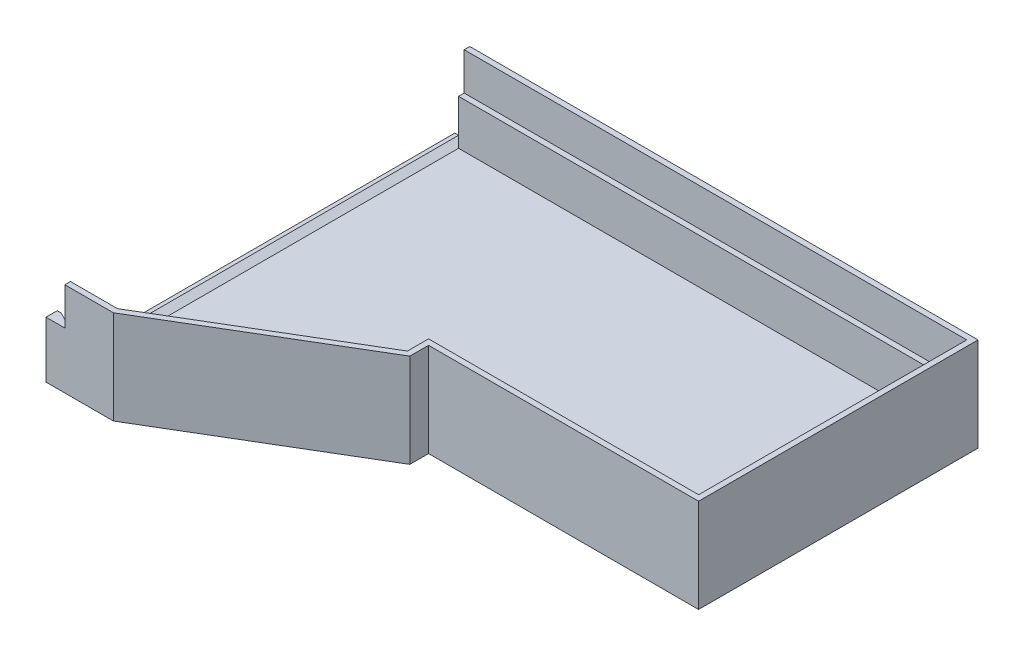
ISO-10303-21;
HEADER;
FILE_DESCRIPTION(('STEP AP214'),'2;1');
FILE_NAME('part.step','',(''),(''),'','','');
FILE_SCHEMA(('AUTOMOTIVE_DESIGN { 1 0 10303 214 1 1 1 1 }'));
ENDSEC;
DATA;
#1=APPLICATION_CONTEXT('core data for automotive mechanical design processes');
#2=APPLICATION_PROTOCOL_DEFINITION('international standard','automotive_design',2000,#1);
#3=PRODUCT_CONTEXT('',#1,'mechanical');
#4=PRODUCT('Part','Part','',(#3));
#5=PRODUCT_RELATED_PRODUCT_CATEGORY('part','',(#4));
#6=PRODUCT_DEFINITION_FORMATION('','',#4);
#7=PRODUCT_DEFINITION_CONTEXT('part definition',#1,'design');
#8=PRODUCT_DEFINITION('design','',#6,#7);
#9=PRODUCT_DEFINITION_SHAPE('','',#8);
#10=(LENGTH_UNIT() NAMED_UNIT(*) SI_UNIT(.MILLI.,.METRE.));
#11=(NAMED_UNIT(*) PLANE_ANGLE_UNIT() SI_UNIT($,.RADIAN.));
#12=(NAMED_UNIT(*) SI_UNIT($,.STERADIAN.) SOLID_ANGLE_UNIT());
#13=UNCERTAINTY_MEASURE_WITH_UNIT(LENGTH_MEASURE(1.E-05),#10,'distance_accuracy_value','');
#14=(GEOMETRIC_REPRESENTATION_CONTEXT(3) GLOBAL_UNCERTAINTY_ASSIGNED_CONTEXT((#13)) GLOBAL_UNIT_ASSIGNED_CONTEXT((#10,
#11,#12)) REPRESENTATION_CONTEXT('',''));
#15=CARTESIAN_POINT('',(0.,0.,0.));
#16=DIRECTION('',(0.,0.,1.));
#17=DIRECTION('',(1.,0.,0.));
#18=AXIS2_PLACEMENT_3D('',#15,#16,#17);
#19=CARTESIAN_POINT('',(-142.,25.,105.5));
#20=DIRECTION('',(0.,0.,-1.));
#21=DIRECTION('',(-1.,0.,0.));
#22=AXIS2_PLACEMENT_3D('',#19,#20,#21);
#23=PLANE('',#22);
#24=DIRECTION('',(0.,1.,0.));
#25=VECTOR('',#24,1.);
#26=CARTESIAN_POINT('',(-138.,15.,105.5));
#27=LINE('',#26,#25);
#28=CARTESIAN_POINT('',(-138.,15.,105.5));
#29=VERTEX_POINT('',#28);
#30=CARTESIAN_POINT('',(-138.,25.,105.5));
#31=VERTEX_POINT('',#30);
#32=EDGE_CURVE('E617',#29,#31,#27,.T.);
#33=ORIENTED_EDGE('',*,*,#32,.F.);
#34=DIRECTION('',(-1.,0.,0.));
#35=VECTOR('',#34,1.);
#36=CARTESIAN_POINT('',(-138.,15.,105.5));
#37=LINE('',#36,#35);
#38=CARTESIAN_POINT('',(-143.,15.,105.5));
#39=VERTEX_POINT('',#38);
#40=EDGE_CURVE('E197',#29,#39,#37,.T.);
#41=ORIENTED_EDGE('',*,*,#40,.T.);
#42=DIRECTION('',(0.,-1.,0.));
#43=VECTOR('',#42,1.);
#44=CARTESIAN_POINT('',(-143.,25.,105.5));
#45=LINE('',#44,#43);
#46=CARTESIAN_POINT('',(-143.,0.,105.5));
#47=VERTEX_POINT('',#46);
#48=EDGE_CURVE('E175',#39,#47,#45,.T.);
#49=ORIENTED_EDGE('',*,*,#48,.T.);
#50=DIRECTION('',(1.,0.,0.));
#51=VECTOR('',#50,1.);
#52=CARTESIAN_POINT('',(-142.,0.,105.5));
#53=LINE('',#52,#51);
#54=CARTESIAN_POINT('',(-125.036460316705,0.,105.5));
#55=VERTEX_POINT('',#54);
#56=EDGE_CURVE('E149',#47,#55,#53,.T.);
#57=ORIENTED_EDGE('',*,*,#56,.T.);
#58=DIRECTION('',(0.,-1.,0.));
#59=VECTOR('',#58,1.);
#60=CARTESIAN_POINT('',(-125.036460316705,25.,105.5));
#61=LINE('',#60,#59);
#62=CARTESIAN_POINT('',(-125.036460316705,25.,105.5));
#63=VERTEX_POINT('',#62);
#64=EDGE_CURVE('E172',#63,#55,#61,.T.);
#65=ORIENTED_EDGE('',*,*,#64,.F.);
#66=DIRECTION('',(-1.,0.,0.));
#67=VECTOR('',#66,1.);
#68=CARTESIAN_POINT('',(-142.,25.,105.5));
#69=LINE('',#68,#67);
#70=EDGE_CURVE('E103',#63,#31,#69,.T.);
#71=ORIENTED_EDGE('',*,*,#70,.T.);
#72=EDGE_LOOP('',(#33,#41,#49,#57,#65,#71));
#73=FACE_BOUND('',#72,.T.);
#74=ADVANCED_FACE('F45',(#73),#23,.F.);
#75=CARTESIAN_POINT('',(0.,25.,0.));
#76=DIRECTION('',(0.,1.,0.));
#77=DIRECTION('',(0.,0.,1.));
#78=AXIS2_PLACEMENT_3D('',#75,#76,#77);
#79=PLANE('',#78);
#80=DIRECTION('',(1.,0.,0.));
#81=VECTOR('',#80,1.);
#82=CARTESIAN_POINT('',(-138.,25.,104.));
#83=LINE('',#82,#81);
#84=CARTESIAN_POINT('',(-138.,25.,104.));
#85=VERTEX_POINT('',#84);
#86=CARTESIAN_POINT('',(-125.44940589526,25.,104.));
#87=VERTEX_POINT('',#86);
#88=EDGE_CURVE('E649',#85,#87,#83,.T.);
#89=ORIENTED_EDGE('',*,*,#88,.F.);
#90=DIRECTION('',(0.,0.,1.));
#91=VECTOR('',#90,1.);
#92=CARTESIAN_POINT('',(-138.,25.,104.));
#93=LINE('',#92,#91);
#94=EDGE_CURVE('E673',#85,#31,#93,.T.);
#95=ORIENTED_EDGE('',*,*,#94,.T.);
#96=ORIENTED_EDGE('',*,*,#70,.F.);
#97=DIRECTION('',(-0.859101543908756,0.,0.511805175094578));
#98=VECTOR('',#97,1.);
#99=CARTESIAN_POINT('',(-75.5,25.,75.9889172581332));
#100=LINE('',#99,#98);
#101=CARTESIAN_POINT('',(-75.5,25.,75.9889172581332));
#102=VERTEX_POINT('',#101);
#103=EDGE_CURVE('E131',#102,#63,#100,.T.);
#104=ORIENTED_EDGE('',*,*,#103,.F.);
#105=DIRECTION('',(0.,0.,1.));
#106=VECTOR('',#105,1.);
#107=CARTESIAN_POINT('',(-75.5,25.,71.));
#108=LINE('',#107,#106);
#109=CARTESIAN_POINT('',(-75.5,25.,71.));
#110=VERTEX_POINT('',#109);
#111=EDGE_CURVE('E116',#110,#102,#108,.T.);
#112=ORIENTED_EDGE('',*,*,#111,.F.);
#113=DIRECTION('',(-1.,0.,0.));
#114=VECTOR('',#113,1.);
#115=CARTESIAN_POINT('',(-3.5,25.,71.));
#116=LINE('',#115,#114);
#117=CARTESIAN_POINT('',(-3.5,25.,71.));
#118=VERTEX_POINT('',#117);
#119=EDGE_CURVE('E129',#118,#110,#116,.T.);
#120=ORIENTED_EDGE('',*,*,#119,.F.);
#121=DIRECTION('',(0.,0.,1.));
#122=VECTOR('',#121,1.);
#123=CARTESIAN_POINT('',(-3.5,25.,-3.5));
#124=LINE('',#123,#122);
#125=CARTESIAN_POINT('',(-3.5,25.,-3.5));
#126=VERTEX_POINT('',#125);
#127=EDGE_CURVE('E136',#126,#118,#124,.T.);
#128=ORIENTED_EDGE('',*,*,#127,.F.);
#129=DIRECTION('',(-1.,0.,0.));
#130=VECTOR('',#129,1.);
#131=CARTESIAN_POINT('',(-3.5,25.,-3.5));
#132=LINE('',#131,#130);
#133=CARTESIAN_POINT('',(-139.,25.,-3.5));
#134=VERTEX_POINT('',#133);
#135=EDGE_CURVE('E165',#126,#134,#132,.T.);
#136=ORIENTED_EDGE('',*,*,#135,.T.);
#137=DIRECTION('',(0.,0.,-1.));
#138=VECTOR('',#137,1.);
#139=CARTESIAN_POINT('',(-139.,25.,-3.5));
#140=LINE('',#139,#138);
#141=CARTESIAN_POINT('',(-139.,25.,-2.));
#142=VERTEX_POINT('',#141);
#143=EDGE_CURVE('E441',#142,#134,#140,.T.);
#144=ORIENTED_EDGE('',*,*,#143,.F.);
#145=DIRECTION('',(-1.,0.,0.));
#146=VECTOR('',#145,1.);
#147=CARTESIAN_POINT('',(-5.,25.,-2.));
#148=LINE('',#147,#146);
#149=CARTESIAN_POINT('',(-5.,25.,-2.));
#150=VERTEX_POINT('',#149);
#151=EDGE_CURVE('E670',#150,#142,#148,.T.);
#152=ORIENTED_EDGE('',*,*,#151,.F.);
#153=DIRECTION('',(0.,0.,-1.));
#154=VECTOR('',#153,1.);
#155=CARTESIAN_POINT('',(-5.,25.,69.5));
#156=LINE('',#155,#154);
#157=CARTESIAN_POINT('',(-5.,25.,69.5));
#158=VERTEX_POINT('',#157);
#159=EDGE_CURVE('E666',#158,#150,#156,.T.);
#160=ORIENTED_EDGE('',*,*,#159,.F.);
#161=DIRECTION('',(1.,0.,0.));
#162=VECTOR('',#161,1.);
#163=CARTESIAN_POINT('',(-77.,25.,69.5));
#164=LINE('',#163,#162);
#165=CARTESIAN_POINT('',(-77.,25.,69.5));
#166=VERTEX_POINT('',#165);
#167=EDGE_CURVE('E662',#166,#158,#164,.T.);
#168=ORIENTED_EDGE('',*,*,#167,.F.);
#169=DIRECTION('',(0.,0.,-1.));
#170=VECTOR('',#169,1.);
#171=CARTESIAN_POINT('',(-77.,25.,75.1365241475047));
#172=LINE('',#171,#170);
#173=CARTESIAN_POINT('',(-77.,25.,75.1365241475047));
#174=VERTEX_POINT('',#173);
#175=EDGE_CURVE('E658',#174,#166,#172,.T.);
#176=ORIENTED_EDGE('',*,*,#175,.F.);
#177=DIRECTION('',(0.859101543908756,0.,-0.511805175094578));
#178=VECTOR('',#177,1.);
#179=CARTESIAN_POINT('',(-125.44940589526,25.,104.));
#180=LINE('',#179,#178);
#181=EDGE_CURVE('E654',#87,#174,#180,.T.);
#182=ORIENTED_EDGE('',*,*,#181,.F.);
#183=EDGE_LOOP('',(#89,#95,#96,#104,#112,#120,#128,#136,#144,#152,#160,#168,#176,#182));
#184=FACE_BOUND('',#183,.T.);
#185=ADVANCED_FACE('F127',(#184),#79,.T.);
#186=CARTESIAN_POINT('',(-140.,3.,102.5));
#187=DIRECTION('',(0.,0.,1.));
#188=DIRECTION('',(1.,0.,0.));
#189=AXIS2_PLACEMENT_3D('',#186,#187,#188);
#190=PLANE('',#189);
#191=DIRECTION('',(0.,-1.,0.));
#192=VECTOR('',#191,1.);
#193=CARTESIAN_POINT('',(-139.,1.5,102.5));
#194=LINE('',#193,#192);
#195=CARTESIAN_POINT('',(-139.,15.,102.5));
#196=VERTEX_POINT('',#195);
#197=CARTESIAN_POINT('',(-139.,3.,102.5));
#198=VERTEX_POINT('',#197);
#199=EDGE_CURVE('E613',#196,#198,#194,.T.);
#200=ORIENTED_EDGE('',*,*,#199,.F.);
#201=DIRECTION('',(1.,0.,0.));
#202=VECTOR('',#201,1.);
#203=CARTESIAN_POINT('',(-139.,15.,102.5));
#204=LINE('',#203,#202);
#205=CARTESIAN_POINT('',(-125.862351473815,15.,102.5));
#206=VERTEX_POINT('',#205);
#207=EDGE_CURVE('E468',#196,#206,#204,.T.);
#208=ORIENTED_EDGE('',*,*,#207,.T.);
#209=DIRECTION('',(0.,1.,0.));
#210=VECTOR('',#209,1.);
#211=CARTESIAN_POINT('',(-125.862351473815,3.,102.5));
#212=LINE('',#211,#210);
#213=CARTESIAN_POINT('',(-125.862351473815,3.,102.5));
#214=VERTEX_POINT('',#213);
#215=EDGE_CURVE('E342',#214,#206,#212,.T.);
#216=ORIENTED_EDGE('',*,*,#215,.F.);
#217=DIRECTION('',(1.,0.,0.));
#218=VECTOR('',#217,1.);
#219=CARTESIAN_POINT('',(-140.,3.,102.5));
#220=LINE('',#219,#218);
#221=EDGE_CURVE('E452',#198,#214,#220,.T.);
#222=ORIENTED_EDGE('',*,*,#221,.F.);
#223=EDGE_LOOP('',(#200,#208,#216,#222));
#224=FACE_BOUND('',#223,.T.);
#225=ADVANCED_FACE('F381',(#224),#190,.F.);
#226=CARTESIAN_POINT('',(0.,3.,0.));
#227=DIRECTION('',(0.,1.,0.));
#228=DIRECTION('',(0.,0.,1.));
#229=AXIS2_PLACEMENT_3D('',#226,#227,#228);
#230=PLANE('',#229);
#231=DIRECTION('',(-1.,0.,0.));
#232=VECTOR('',#231,1.);
#233=CARTESIAN_POINT('',(-6.5,3.,-0.5));
#234=LINE('',#233,#232);
#235=CARTESIAN_POINT('',(-6.5,3.,-0.5));
#236=VERTEX_POINT('',#235);
#237=CARTESIAN_POINT('',(-139.,3.,-0.5));
#238=VERTEX_POINT('',#237);
#239=EDGE_CURVE('E332',#236,#238,#234,.T.);
#240=ORIENTED_EDGE('',*,*,#239,.T.);
#241=DIRECTION('',(0.,0.,1.));
#242=VECTOR('',#241,1.);
#243=CARTESIAN_POINT('',(-139.,3.,-3.5));
#244=LINE('',#243,#242);
#245=EDGE_CURVE('E427',#238,#198,#244,.T.);
#246=ORIENTED_EDGE('',*,*,#245,.T.);
#247=ORIENTED_EDGE('',*,*,#221,.T.);
#248=DIRECTION('',(0.859101543908756,0.,-0.511805175094578));
#249=VECTOR('',#248,1.);
#250=CARTESIAN_POINT('',(-125.862351473815,3.,102.5));
#251=LINE('',#250,#249);
#252=CARTESIAN_POINT('',(-78.5,3.,74.2841310368762));
#253=VERTEX_POINT('',#252);
#254=EDGE_CURVE('E455',#214,#253,#251,.T.);
#255=ORIENTED_EDGE('',*,*,#254,.T.);
#256=DIRECTION('',(0.,0.,-1.));
#257=VECTOR('',#256,1.);
#258=CARTESIAN_POINT('',(-78.5,3.,74.2841310368762));
#259=LINE('',#258,#257);
#260=CARTESIAN_POINT('',(-78.5,3.,68.));
#261=VERTEX_POINT('',#260);
#262=EDGE_CURVE('E459',#253,#261,#259,.T.);
#263=ORIENTED_EDGE('',*,*,#262,.T.);
#264=DIRECTION('',(1.,0.,0.));
#265=VECTOR('',#264,1.);
#266=CARTESIAN_POINT('',(-78.5,3.,68.));
#267=LINE('',#266,#265);
#268=CARTESIAN_POINT('',(-6.5,3.,68.));
#269=VERTEX_POINT('',#268);
#270=EDGE_CURVE('E334',#261,#269,#267,.T.);
#271=ORIENTED_EDGE('',*,*,#270,.T.);
#272=DIRECTION('',(0.,0.,-1.));
#273=VECTOR('',#272,1.);
#274=CARTESIAN_POINT('',(-6.5,3.,68.));
#275=LINE('',#274,#273);
#276=EDGE_CURVE('E320',#269,#236,#275,.T.);
#277=ORIENTED_EDGE('',*,*,#276,.T.);
#278=EDGE_LOOP('',(#240,#246,#247,#255,#263,#271,#277));
#279=FACE_BOUND('',#278,.T.);
#280=ADVANCED_FACE('F330',(#279),#230,.T.);
#281=CARTESIAN_POINT('',(-142.,25.,-3.5));
#282=DIRECTION('',(0.,0.,1.));
#283=DIRECTION('',(1.,0.,0.));
#284=AXIS2_PLACEMENT_3D('',#281,#282,#283);
#285=PLANE('',#284);
#286=DIRECTION('',(-1.,0.,0.));
#287=VECTOR('',#286,1.);
#288=CARTESIAN_POINT('',(-143.,3.,-3.5));
#289=LINE('',#288,#287);
#290=CARTESIAN_POINT('',(-142.,3.,-3.5));
#291=VERTEX_POINT('',#290);
#292=CARTESIAN_POINT('',(-143.,3.,-3.5));
#293=VERTEX_POINT('',#292);
#294=EDGE_CURVE('E419',#291,#293,#289,.T.);
#295=ORIENTED_EDGE('',*,*,#294,.F.);
#296=DIRECTION('',(0.894427190999916,-0.447213595499958,0.));
#297=VECTOR('',#296,1.);
#298=CARTESIAN_POINT('',(-139.,1.5,-3.5));
#299=LINE('',#298,#297);
#300=CARTESIAN_POINT('',(-139.,1.5,-3.5));
#301=VERTEX_POINT('',#300);
#302=EDGE_CURVE('E432',#291,#301,#299,.T.);
#303=ORIENTED_EDGE('',*,*,#302,.T.);
#304=DIRECTION('',(0.,1.,0.));
#305=VECTOR('',#304,1.);
#306=CARTESIAN_POINT('',(-139.,3.,-3.5));
#307=LINE('',#306,#305);
#308=EDGE_CURVE('E439',#301,#134,#307,.T.);
#309=ORIENTED_EDGE('',*,*,#308,.T.);
#310=ORIENTED_EDGE('',*,*,#135,.F.);
#311=DIRECTION('',(0.,-1.,0.));
#312=VECTOR('',#311,1.);
#313=CARTESIAN_POINT('',(-3.5,25.,-3.5));
#314=LINE('',#313,#312);
#315=CARTESIAN_POINT('',(-3.5,0.,-3.5));
#316=VERTEX_POINT('',#315);
#317=EDGE_CURVE('E63',#126,#316,#314,.T.);
#318=ORIENTED_EDGE('',*,*,#317,.T.);
#319=DIRECTION('',(-1.,0.,0.));
#320=VECTOR('',#319,1.);
#321=CARTESIAN_POINT('',(-142.,0.,-3.5));
#322=LINE('',#321,#320);
#323=CARTESIAN_POINT('',(-143.,0.,-3.5));
#324=VERTEX_POINT('',#323);
#325=EDGE_CURVE('E95',#316,#324,#322,.T.);
#326=ORIENTED_EDGE('',*,*,#325,.T.);
#327=DIRECTION('',(0.,-1.,0.));
#328=VECTOR('',#327,1.);
#329=CARTESIAN_POINT('',(-143.,25.,-3.5));
#330=LINE('',#329,#328);
#331=EDGE_CURVE('E55',#293,#324,#330,.T.);
#332=ORIENTED_EDGE('',*,*,#331,.F.);
#333=EDGE_LOOP('',(#295,#303,#309,#310,#318,#326,#332));
#334=FACE_BOUND('',#333,.T.);
#335=ADVANCED_FACE('F47',(#334),#285,.F.);
#336=CARTESIAN_POINT('',(-143.,25.,-3.5));
#337=DIRECTION('',(1.,0.,0.));
#338=DIRECTION('',(0.,0.,-1.));
#339=AXIS2_PLACEMENT_3D('',#336,#337,#338);
#340=PLANE('',#339);
#341=ORIENTED_EDGE('',*,*,#48,.F.);
#342=DIRECTION('',(0.,0.,-1.));
#343=VECTOR('',#342,1.);
#344=CARTESIAN_POINT('',(-143.,15.,105.5));
#345=LINE('',#344,#343);
#346=CARTESIAN_POINT('',(-143.,15.,102.5));
#347=VERTEX_POINT('',#346);
#348=EDGE_CURVE('E201',#39,#347,#345,.T.);
#349=ORIENTED_EDGE('',*,*,#348,.T.);
#350=DIRECTION('',(0.,1.,0.));
#351=VECTOR('',#350,1.);
#352=CARTESIAN_POINT('',(-143.,3.,102.5));
#353=LINE('',#352,#351);
#354=CARTESIAN_POINT('',(-143.,3.,102.5));
#355=VERTEX_POINT('',#354);
#356=EDGE_CURVE('E435',#355,#347,#353,.T.);
#357=ORIENTED_EDGE('',*,*,#356,.F.);
#358=DIRECTION('',(0.,0.,1.));
#359=VECTOR('',#358,1.);
#360=CARTESIAN_POINT('',(-143.,3.,-3.5));
#361=LINE('',#360,#359);
#362=EDGE_CURVE('E186',#293,#355,#361,.T.);
#363=ORIENTED_EDGE('',*,*,#362,.F.);
#364=ORIENTED_EDGE('',*,*,#331,.T.);
#365=DIRECTION('',(0.,0.,1.));
#366=VECTOR('',#365,1.);
#367=CARTESIAN_POINT('',(-143.,0.,-3.5));
#368=LINE('',#367,#366);
#369=EDGE_CURVE('E144',#324,#47,#368,.T.);
#370=ORIENTED_EDGE('',*,*,#369,.T.);
#371=EDGE_LOOP('',(#341,#349,#357,#363,#364,#370));
#372=FACE_BOUND('',#371,.T.);
#373=ADVANCED_FACE('F182',(#372),#340,.F.);
#374=CARTESIAN_POINT('',(-75.5,25.,75.9889172581332));
#375=DIRECTION('',(0.511805175094578,0.,0.859101543908756));
#376=DIRECTION('',(0.859101543908756,0.,-0.511805175094578));
#377=AXIS2_PLACEMENT_3D('',#374,#375,#376);
#378=PLANE('',#377);
#379=DIRECTION('',(-0.859101543908756,0.,0.511805175094578));
#380=VECTOR('',#379,1.);
#381=CARTESIAN_POINT('',(-75.5,0.,75.9889172581332));
#382=LINE('',#381,#380);
#383=CARTESIAN_POINT('',(-75.5,0.,75.9889172581332));
#384=VERTEX_POINT('',#383);
#385=EDGE_CURVE('E153',#384,#55,#382,.T.);
#386=ORIENTED_EDGE('',*,*,#385,.F.);
#387=DIRECTION('',(0.,-1.,0.));
#388=VECTOR('',#387,1.);
#389=CARTESIAN_POINT('',(-75.5,25.,75.9889172581332));
#390=LINE('',#389,#388);
#391=EDGE_CURVE('E123',#102,#384,#390,.T.);
#392=ORIENTED_EDGE('',*,*,#391,.F.);
#393=ORIENTED_EDGE('',*,*,#103,.T.);
#394=ORIENTED_EDGE('',*,*,#64,.T.);
#395=EDGE_LOOP('',(#386,#392,#393,#394));
#396=FACE_BOUND('',#395,.T.);
#397=ADVANCED_FACE('F365',(#396),#378,.T.);
#398=CARTESIAN_POINT('',(-75.5,25.,71.));
#399=DIRECTION('',(1.,0.,0.));
#400=DIRECTION('',(0.,0.,-1.));
#401=AXIS2_PLACEMENT_3D('',#398,#399,#400);
#402=PLANE('',#401);
#403=DIRECTION('',(0.,0.,1.));
#404=VECTOR('',#403,1.);
#405=CARTESIAN_POINT('',(-75.5,0.,71.));
#406=LINE('',#405,#404);
#407=CARTESIAN_POINT('',(-75.5,0.,71.));
#408=VERTEX_POINT('',#407);
#409=EDGE_CURVE('E118',#408,#384,#406,.T.);
#410=ORIENTED_EDGE('',*,*,#409,.F.);
#411=DIRECTION('',(0.,-1.,0.));
#412=VECTOR('',#411,1.);
#413=CARTESIAN_POINT('',(-75.5,25.,71.));
#414=LINE('',#413,#412);
#415=EDGE_CURVE('E113',#110,#408,#414,.T.);
#416=ORIENTED_EDGE('',*,*,#415,.F.);
#417=ORIENTED_EDGE('',*,*,#111,.T.);
#418=ORIENTED_EDGE('',*,*,#391,.T.);
#419=EDGE_LOOP('',(#410,#416,#417,#418));
#420=FACE_BOUND('',#419,.T.);
#421=ADVANCED_FACE('F115',(#420),#402,.T.);
#422=CARTESIAN_POINT('',(-3.5,25.,71.));
#423=DIRECTION('',(0.,0.,1.));
#424=DIRECTION('',(1.,0.,0.));
#425=AXIS2_PLACEMENT_3D('',#422,#423,#424);
#426=PLANE('',#425);
#427=DIRECTION('',(-1.,0.,0.));
#428=VECTOR('',#427,1.);
#429=CARTESIAN_POINT('',(-3.5,0.,71.));
#430=LINE('',#429,#428);
#431=CARTESIAN_POINT('',(-3.5,0.,71.));
#432=VERTEX_POINT('',#431);
#433=EDGE_CURVE('E159',#432,#408,#430,.T.);
#434=ORIENTED_EDGE('',*,*,#433,.F.);
#435=DIRECTION('',(0.,-1.,0.));
#436=VECTOR('',#435,1.);
#437=CARTESIAN_POINT('',(-3.5,25.,71.));
#438=LINE('',#437,#436);
#439=EDGE_CURVE('E87',#118,#432,#438,.T.);
#440=ORIENTED_EDGE('',*,*,#439,.F.);
#441=ORIENTED_EDGE('',*,*,#119,.T.);
#442=ORIENTED_EDGE('',*,*,#415,.T.);
#443=EDGE_LOOP('',(#434,#440,#441,#442));
#444=FACE_BOUND('',#443,.T.);
#445=ADVANCED_FACE('F134',(#444),#426,.T.);
#446=CARTESIAN_POINT('',(-3.5,25.,-3.5));
#447=DIRECTION('',(1.,0.,0.));
#448=DIRECTION('',(0.,0.,-1.));
#449=AXIS2_PLACEMENT_3D('',#446,#447,#448);
#450=PLANE('',#449);
#451=DIRECTION('',(0.,0.,1.));
#452=VECTOR('',#451,1.);
#453=CARTESIAN_POINT('',(-3.5,0.,-3.5));
#454=LINE('',#453,#452);
#455=EDGE_CURVE('E162',#316,#432,#454,.T.);
#456=ORIENTED_EDGE('',*,*,#455,.F.);
#457=ORIENTED_EDGE('',*,*,#317,.F.);
#458=ORIENTED_EDGE('',*,*,#127,.T.);
#459=ORIENTED_EDGE('',*,*,#439,.T.);
#460=EDGE_LOOP('',(#456,#457,#458,#459));
#461=FACE_BOUND('',#460,.T.);
#462=ADVANCED_FACE('F366',(#461),#450,.T.);
#463=CARTESIAN_POINT('',(0.,0.,0.));
#464=DIRECTION('',(0.,1.,0.));
#465=DIRECTION('',(0.,0.,1.));
#466=AXIS2_PLACEMENT_3D('',#463,#464,#465);
#467=PLANE('',#466);
#468=ORIENTED_EDGE('',*,*,#325,.F.);
#469=ORIENTED_EDGE('',*,*,#455,.T.);
#470=ORIENTED_EDGE('',*,*,#433,.T.);
#471=ORIENTED_EDGE('',*,*,#409,.T.);
#472=ORIENTED_EDGE('',*,*,#385,.T.);
#473=ORIENTED_EDGE('',*,*,#56,.F.);
#474=ORIENTED_EDGE('',*,*,#369,.F.);
#475=EDGE_LOOP('',(#468,#469,#470,#471,#472,#473,#474));
#476=FACE_BOUND('',#475,.T.);
#477=ADVANCED_FACE('F190',(#476),#467,.F.);
#478=CARTESIAN_POINT('',(-6.5,3.,-0.5));
#479=DIRECTION('',(0.,0.,-1.));
#480=DIRECTION('',(-1.,0.,0.));
#481=AXIS2_PLACEMENT_3D('',#478,#479,#480);
#482=PLANE('',#481);
#483=DIRECTION('',(0.,1.,0.));
#484=VECTOR('',#483,1.);
#485=CARTESIAN_POINT('',(-6.5,3.,-0.5));
#486=LINE('',#485,#484);
#487=CARTESIAN_POINT('',(-6.5,15.,-0.5));
#488=VERTEX_POINT('',#487);
#489=EDGE_CURVE('E145',#236,#488,#486,.T.);
#490=ORIENTED_EDGE('',*,*,#489,.T.);
#491=DIRECTION('',(-1.,0.,0.));
#492=VECTOR('',#491,1.);
#493=CARTESIAN_POINT('',(-6.5,15.,-0.5));
#494=LINE('',#493,#492);
#495=CARTESIAN_POINT('',(-139.,15.,-0.5));
#496=VERTEX_POINT('',#495);
#497=EDGE_CURVE('E702',#488,#496,#494,.T.);
#498=ORIENTED_EDGE('',*,*,#497,.T.);
#499=DIRECTION('',(0.,-1.,0.));
#500=VECTOR('',#499,1.);
#501=CARTESIAN_POINT('',(-139.,3.,-0.5));
#502=LINE('',#501,#500);
#503=EDGE_CURVE('E339',#496,#238,#502,.T.);
#504=ORIENTED_EDGE('',*,*,#503,.T.);
#505=ORIENTED_EDGE('',*,*,#239,.F.);
#506=EDGE_LOOP('',(#490,#498,#504,#505));
#507=FACE_BOUND('',#506,.T.);
#508=ADVANCED_FACE('F337',(#507),#482,.F.);
#509=CARTESIAN_POINT('',(-6.5,3.,68.));
#510=DIRECTION('',(1.,0.,0.));
#511=DIRECTION('',(0.,0.,-1.));
#512=AXIS2_PLACEMENT_3D('',#509,#510,#511);
#513=PLANE('',#512);
#514=DIRECTION('',(0.,1.,0.));
#515=VECTOR('',#514,1.);
#516=CARTESIAN_POINT('',(-6.5,3.,68.));
#517=LINE('',#516,#515);
#518=CARTESIAN_POINT('',(-6.50000000000001,15.,68.));
#519=VERTEX_POINT('',#518);
#520=EDGE_CURVE('E312',#269,#519,#517,.T.);
#521=ORIENTED_EDGE('',*,*,#520,.T.);
#522=DIRECTION('',(0.,0.,-1.));
#523=VECTOR('',#522,1.);
#524=CARTESIAN_POINT('',(-6.50000000000001,15.,68.));
#525=LINE('',#524,#523);
#526=EDGE_CURVE('E322',#519,#488,#525,.T.);
#527=ORIENTED_EDGE('',*,*,#526,.T.);
#528=ORIENTED_EDGE('',*,*,#489,.F.);
#529=ORIENTED_EDGE('',*,*,#276,.F.);
#530=EDGE_LOOP('',(#521,#527,#528,#529));
#531=FACE_BOUND('',#530,.T.);
#532=ADVANCED_FACE('F319',(#531),#513,.F.);
#533=CARTESIAN_POINT('',(-78.5,3.,68.));
#534=DIRECTION('',(0.,0.,1.));
#535=DIRECTION('',(1.,0.,0.));
#536=AXIS2_PLACEMENT_3D('',#533,#534,#535);
#537=PLANE('',#536);
#538=DIRECTION('',(0.,1.,0.));
#539=VECTOR('',#538,1.);
#540=CARTESIAN_POINT('',(-78.5,3.,68.));
#541=LINE('',#540,#539);
#542=CARTESIAN_POINT('',(-78.5,15.,68.));
#543=VERTEX_POINT('',#542);
#544=EDGE_CURVE('E352',#261,#543,#541,.T.);
#545=ORIENTED_EDGE('',*,*,#544,.T.);
#546=DIRECTION('',(1.,0.,0.));
#547=VECTOR('',#546,1.);
#548=CARTESIAN_POINT('',(-78.5,15.,68.));
#549=LINE('',#548,#547);
#550=EDGE_CURVE('E707',#543,#519,#549,.T.);
#551=ORIENTED_EDGE('',*,*,#550,.T.);
#552=ORIENTED_EDGE('',*,*,#520,.F.);
#553=ORIENTED_EDGE('',*,*,#270,.F.);
#554=EDGE_LOOP('',(#545,#551,#552,#553));
#555=FACE_BOUND('',#554,.T.);
#556=ADVANCED_FACE('F477',(#555),#537,.F.);
#557=CARTESIAN_POINT('',(-78.5,3.,74.2841310368762));
#558=DIRECTION('',(1.,0.,0.));
#559=DIRECTION('',(0.,0.,-1.));
#560=AXIS2_PLACEMENT_3D('',#557,#558,#559);
#561=PLANE('',#560);
#562=DIRECTION('',(0.,1.,0.));
#563=VECTOR('',#562,1.);
#564=CARTESIAN_POINT('',(-78.5,3.,74.2841310368762));
#565=LINE('',#564,#563);
#566=CARTESIAN_POINT('',(-78.5,15.,74.2841310368762));
#567=VERTEX_POINT('',#566);
#568=EDGE_CURVE('E346',#253,#567,#565,.T.);
#569=ORIENTED_EDGE('',*,*,#568,.T.);
#570=DIRECTION('',(0.,0.,-1.));
#571=VECTOR('',#570,1.);
#572=CARTESIAN_POINT('',(-78.5,15.,74.2841310368762));
#573=LINE('',#572,#571);
#574=EDGE_CURVE('E476',#567,#543,#573,.T.);
#575=ORIENTED_EDGE('',*,*,#574,.T.);
#576=ORIENTED_EDGE('',*,*,#544,.F.);
#577=ORIENTED_EDGE('',*,*,#262,.F.);
#578=EDGE_LOOP('',(#569,#575,#576,#577));
#579=FACE_BOUND('',#578,.T.);
#580=ADVANCED_FACE('F475',(#579),#561,.F.);
#581=CARTESIAN_POINT('',(-125.862351473815,3.,102.5));
#582=DIRECTION('',(0.511805175094578,0.,0.859101543908756));
#583=DIRECTION('',(0.859101543908756,0.,-0.511805175094578));
#584=AXIS2_PLACEMENT_3D('',#581,#582,#583);
#585=PLANE('',#584);
#586=ORIENTED_EDGE('',*,*,#215,.T.);
#587=DIRECTION('',(0.859101543908756,0.,-0.511805175094578));
#588=VECTOR('',#587,1.);
#589=CARTESIAN_POINT('',(-125.862351473815,15.,102.5));
#590=LINE('',#589,#588);
#591=EDGE_CURVE('E472',#206,#567,#590,.T.);
#592=ORIENTED_EDGE('',*,*,#591,.T.);
#593=ORIENTED_EDGE('',*,*,#568,.F.);
#594=ORIENTED_EDGE('',*,*,#254,.F.);
#595=EDGE_LOOP('',(#586,#592,#593,#594));
#596=FACE_BOUND('',#595,.T.);
#597=ADVANCED_FACE('F413',(#596),#585,.F.);
#598=ORIENTED_EDGE('',*,*,#356,.T.);
#599=DIRECTION('',(1.,0.,0.));
#600=VECTOR('',#599,1.);
#601=CARTESIAN_POINT('',(-143.,15.,102.5));
#602=LINE('',#601,#600);
#603=CARTESIAN_POINT('',(-142.,15.,102.5));
#604=VERTEX_POINT('',#603);
#605=EDGE_CURVE('E719',#347,#604,#602,.T.);
#606=ORIENTED_EDGE('',*,*,#605,.T.);
#607=DIRECTION('',(0.,1.,0.));
#608=VECTOR('',#607,1.);
#609=CARTESIAN_POINT('',(-142.,1.5,102.5));
#610=LINE('',#609,#608);
#611=CARTESIAN_POINT('',(-142.,3.,102.5));
#612=VERTEX_POINT('',#611);
#613=EDGE_CURVE('E610',#612,#604,#610,.T.);
#614=ORIENTED_EDGE('',*,*,#613,.F.);
#615=EDGE_CURVE('E420',#355,#612,#220,.T.);
#616=ORIENTED_EDGE('',*,*,#615,.F.);
#617=EDGE_LOOP('',(#598,#606,#614,#616));
#618=FACE_BOUND('',#617,.T.);
#619=ADVANCED_FACE('F402',(#618),#190,.F.);
#620=DIRECTION('',(0.,0.,1.));
#621=VECTOR('',#620,1.);
#622=CARTESIAN_POINT('',(-142.,3.,-3.5));
#623=LINE('',#622,#621);
#624=EDGE_CURVE('E418',#291,#612,#623,.T.);
#625=ORIENTED_EDGE('',*,*,#624,.F.);
#626=ORIENTED_EDGE('',*,*,#294,.T.);
#627=ORIENTED_EDGE('',*,*,#362,.T.);
#628=ORIENTED_EDGE('',*,*,#615,.T.);
#629=EDGE_LOOP('',(#625,#626,#627,#628));
#630=FACE_BOUND('',#629,.T.);
#631=ADVANCED_FACE('F397',(#630),#230,.T.);
#632=CARTESIAN_POINT('',(-139.,3.,-3.5));
#633=DIRECTION('',(1.,0.,0.));
#634=DIRECTION('',(0.,0.,-1.));
#635=AXIS2_PLACEMENT_3D('',#632,#633,#634);
#636=PLANE('',#635);
#637=DIRECTION('',(0.,-1.,0.));
#638=VECTOR('',#637,1.);
#639=CARTESIAN_POINT('',(-139.,1.5,104.));
#640=LINE('',#639,#638);
#641=CARTESIAN_POINT('',(-139.,15.,104.));
#642=VERTEX_POINT('',#641);
#643=CARTESIAN_POINT('',(-139.,1.5,104.));
#644=VERTEX_POINT('',#643);
#645=EDGE_CURVE('E428',#642,#644,#640,.T.);
#646=ORIENTED_EDGE('',*,*,#645,.F.);
#647=DIRECTION('',(0.,0.,1.));
#648=VECTOR('',#647,1.);
#649=CARTESIAN_POINT('',(-139.,15.,102.5));
#650=LINE('',#649,#648);
#651=EDGE_CURVE('E716',#196,#642,#650,.T.);
#652=ORIENTED_EDGE('',*,*,#651,.F.);
#653=ORIENTED_EDGE('',*,*,#199,.T.);
#654=ORIENTED_EDGE('',*,*,#245,.F.);
#655=ORIENTED_EDGE('',*,*,#503,.F.);
#656=DIRECTION('',(0.,0.,-1.));
#657=VECTOR('',#656,1.);
#658=CARTESIAN_POINT('',(-139.,15.,-0.5));
#659=LINE('',#658,#657);
#660=CARTESIAN_POINT('',(-139.,15.,-2.));
#661=VERTEX_POINT('',#660);
#662=EDGE_CURVE('E699',#496,#661,#659,.T.);
#663=ORIENTED_EDGE('',*,*,#662,.T.);
#664=DIRECTION('',(0.,1.,0.));
#665=VECTOR('',#664,1.);
#666=CARTESIAN_POINT('',(-139.,15.,-2.));
#667=LINE('',#666,#665);
#668=EDGE_CURVE('E622',#661,#142,#667,.T.);
#669=ORIENTED_EDGE('',*,*,#668,.T.);
#670=ORIENTED_EDGE('',*,*,#143,.T.);
#671=ORIENTED_EDGE('',*,*,#308,.F.);
#672=DIRECTION('',(0.,0.,1.));
#673=VECTOR('',#672,1.);
#674=CARTESIAN_POINT('',(-139.,1.5,-3.5));
#675=LINE('',#674,#673);
#676=EDGE_CURVE('E447',#301,#644,#675,.T.);
#677=ORIENTED_EDGE('',*,*,#676,.T.);
#678=EDGE_LOOP('',(#646,#652,#653,#654,#655,#663,#669,#670,#671,#677));
#679=FACE_BOUND('',#678,.T.);
#680=ADVANCED_FACE('F406',(#679),#636,.F.);
#681=CARTESIAN_POINT('',(-138.,15.,104.));
#682=DIRECTION('',(-1.,0.,0.));
#683=DIRECTION('',(0.,0.,1.));
#684=AXIS2_PLACEMENT_3D('',#681,#682,#683);
#685=PLANE('',#684);
#686=ORIENTED_EDGE('',*,*,#94,.F.);
#687=DIRECTION('',(0.,1.,0.));
#688=VECTOR('',#687,1.);
#689=CARTESIAN_POINT('',(-138.,15.,104.));
#690=LINE('',#689,#688);
#691=CARTESIAN_POINT('',(-138.,15.,104.));
#692=VERTEX_POINT('',#691);
#693=EDGE_CURVE('E645',#692,#85,#690,.T.);
#694=ORIENTED_EDGE('',*,*,#693,.F.);
#695=DIRECTION('',(0.,0.,1.));
#696=VECTOR('',#695,1.);
#697=CARTESIAN_POINT('',(-138.,15.,104.));
#698=LINE('',#697,#696);
#699=EDGE_CURVE('E653',#692,#29,#698,.T.);
#700=ORIENTED_EDGE('',*,*,#699,.T.);
#701=ORIENTED_EDGE('',*,*,#32,.T.);
#702=EDGE_LOOP('',(#686,#694,#700,#701));
#703=FACE_BOUND('',#702,.T.);
#704=ADVANCED_FACE('F411',(#703),#685,.T.);
#705=CARTESIAN_POINT('',(-5.,15.,-2.));
#706=DIRECTION('',(0.,0.,-1.));
#707=DIRECTION('',(-1.,0.,0.));
#708=AXIS2_PLACEMENT_3D('',#705,#706,#707);
#709=PLANE('',#708);
#710=ORIENTED_EDGE('',*,*,#151,.T.);
#711=ORIENTED_EDGE('',*,*,#668,.F.);
#712=DIRECTION('',(-1.,0.,0.));
#713=VECTOR('',#712,1.);
#714=CARTESIAN_POINT('',(-5.,15.,-2.));
#715=LINE('',#714,#713);
#716=CARTESIAN_POINT('',(-5.,15.,-2.));
#717=VERTEX_POINT('',#716);
#718=EDGE_CURVE('E695',#717,#661,#715,.T.);
#719=ORIENTED_EDGE('',*,*,#718,.F.);
#720=DIRECTION('',(0.,1.,0.));
#721=VECTOR('',#720,1.);
#722=CARTESIAN_POINT('',(-5.,15.,-2.));
#723=LINE('',#722,#721);
#724=EDGE_CURVE('E627',#717,#150,#723,.T.);
#725=ORIENTED_EDGE('',*,*,#724,.T.);
#726=EDGE_LOOP('',(#710,#711,#719,#725));
#727=FACE_BOUND('',#726,.T.);
#728=ADVANCED_FACE('F500',(#727),#709,.F.);
#729=CARTESIAN_POINT('',(-5.,15.,69.5));
#730=DIRECTION('',(1.,0.,0.));
#731=DIRECTION('',(0.,0.,-1.));
#732=AXIS2_PLACEMENT_3D('',#729,#730,#731);
#733=PLANE('',#732);
#734=ORIENTED_EDGE('',*,*,#159,.T.);
#735=ORIENTED_EDGE('',*,*,#724,.F.);
#736=DIRECTION('',(0.,0.,-1.));
#737=VECTOR('',#736,1.);
#738=CARTESIAN_POINT('',(-5.,15.,69.5));
#739=LINE('',#738,#737);
#740=CARTESIAN_POINT('',(-5.,15.,69.5));
#741=VERTEX_POINT('',#740);
#742=EDGE_CURVE('E691',#741,#717,#739,.T.);
#743=ORIENTED_EDGE('',*,*,#742,.F.);
#744=DIRECTION('',(0.,1.,0.));
#745=VECTOR('',#744,1.);
#746=CARTESIAN_POINT('',(-5.,15.,69.5));
#747=LINE('',#746,#745);
#748=EDGE_CURVE('E631',#741,#158,#747,.T.);
#749=ORIENTED_EDGE('',*,*,#748,.T.);
#750=EDGE_LOOP('',(#734,#735,#743,#749));
#751=FACE_BOUND('',#750,.T.);
#752=ADVANCED_FACE('F510',(#751),#733,.F.);
#753=CARTESIAN_POINT('',(-77.,15.,69.5));
#754=DIRECTION('',(0.,0.,1.));
#755=DIRECTION('',(1.,0.,0.));
#756=AXIS2_PLACEMENT_3D('',#753,#754,#755);
#757=PLANE('',#756);
#758=ORIENTED_EDGE('',*,*,#167,.T.);
#759=ORIENTED_EDGE('',*,*,#748,.F.);
#760=DIRECTION('',(1.,0.,0.));
#761=VECTOR('',#760,1.);
#762=CARTESIAN_POINT('',(-77.,15.,69.5));
#763=LINE('',#762,#761);
#764=CARTESIAN_POINT('',(-77.,15.,69.5));
#765=VERTEX_POINT('',#764);
#766=EDGE_CURVE('E687',#765,#741,#763,.T.);
#767=ORIENTED_EDGE('',*,*,#766,.F.);
#768=DIRECTION('',(0.,1.,0.));
#769=VECTOR('',#768,1.);
#770=CARTESIAN_POINT('',(-77.,15.,69.5));
#771=LINE('',#770,#769);
#772=EDGE_CURVE('E636',#765,#166,#771,.T.);
#773=ORIENTED_EDGE('',*,*,#772,.T.);
#774=EDGE_LOOP('',(#758,#759,#767,#773));
#775=FACE_BOUND('',#774,.T.);
#776=ADVANCED_FACE('F519',(#775),#757,.F.);
#777=CARTESIAN_POINT('',(-77.,15.,75.1365241475047));
#778=DIRECTION('',(1.,0.,0.));
#779=DIRECTION('',(0.,0.,-1.));
#780=AXIS2_PLACEMENT_3D('',#777,#778,#779);
#781=PLANE('',#780);
#782=ORIENTED_EDGE('',*,*,#175,.T.);
#783=ORIENTED_EDGE('',*,*,#772,.F.);
#784=DIRECTION('',(0.,0.,-1.));
#785=VECTOR('',#784,1.);
#786=CARTESIAN_POINT('',(-77.,15.,75.1365241475047));
#787=LINE('',#786,#785);
#788=CARTESIAN_POINT('',(-77.,15.,75.1365241475047));
#789=VERTEX_POINT('',#788);
#790=EDGE_CURVE('E683',#789,#765,#787,.T.);
#791=ORIENTED_EDGE('',*,*,#790,.F.);
#792=DIRECTION('',(0.,1.,0.));
#793=VECTOR('',#792,1.);
#794=CARTESIAN_POINT('',(-77.,15.,75.1365241475047));
#795=LINE('',#794,#793);
#796=EDGE_CURVE('E639',#789,#174,#795,.T.);
#797=ORIENTED_EDGE('',*,*,#796,.T.);
#798=EDGE_LOOP('',(#782,#783,#791,#797));
#799=FACE_BOUND('',#798,.T.);
#800=ADVANCED_FACE('F528',(#799),#781,.F.);
#801=CARTESIAN_POINT('',(-125.44940589526,15.,104.));
#802=DIRECTION('',(0.511805175094578,0.,0.859101543908756));
#803=DIRECTION('',(0.859101543908756,0.,-0.511805175094578));
#804=AXIS2_PLACEMENT_3D('',#801,#802,#803);
#805=PLANE('',#804);
#806=ORIENTED_EDGE('',*,*,#181,.T.);
#807=ORIENTED_EDGE('',*,*,#796,.F.);
#808=DIRECTION('',(0.859101543908756,0.,-0.511805175094578));
#809=VECTOR('',#808,1.);
#810=CARTESIAN_POINT('',(-125.44940589526,15.,104.));
#811=LINE('',#810,#809);
#812=CARTESIAN_POINT('',(-125.44940589526,15.,104.));
#813=VERTEX_POINT('',#812);
#814=EDGE_CURVE('E679',#813,#789,#811,.T.);
#815=ORIENTED_EDGE('',*,*,#814,.F.);
#816=DIRECTION('',(0.,1.,0.));
#817=VECTOR('',#816,1.);
#818=CARTESIAN_POINT('',(-125.44940589526,15.,104.));
#819=LINE('',#818,#817);
#820=EDGE_CURVE('E642',#813,#87,#819,.T.);
#821=ORIENTED_EDGE('',*,*,#820,.T.);
#822=EDGE_LOOP('',(#806,#807,#815,#821));
#823=FACE_BOUND('',#822,.T.);
#824=ADVANCED_FACE('F537',(#823),#805,.F.);
#825=CARTESIAN_POINT('',(-138.,15.,104.));
#826=DIRECTION('',(0.,0.,1.));
#827=DIRECTION('',(1.,0.,0.));
#828=AXIS2_PLACEMENT_3D('',#825,#826,#827);
#829=PLANE('',#828);
#830=ORIENTED_EDGE('',*,*,#88,.T.);
#831=ORIENTED_EDGE('',*,*,#820,.F.);
#832=DIRECTION('',(1.,0.,0.));
#833=VECTOR('',#832,1.);
#834=CARTESIAN_POINT('',(-138.,15.,104.));
#835=LINE('',#834,#833);
#836=EDGE_CURVE('E648',#692,#813,#835,.T.);
#837=ORIENTED_EDGE('',*,*,#836,.F.);
#838=ORIENTED_EDGE('',*,*,#693,.T.);
#839=EDGE_LOOP('',(#830,#831,#837,#838));
#840=FACE_BOUND('',#839,.T.);
#841=ADVANCED_FACE('F546',(#840),#829,.F.);
#842=CARTESIAN_POINT('',(0.,15.,0.));
#843=DIRECTION('',(0.,-1.,0.));
#844=DIRECTION('',(0.,0.,-1.));
#845=AXIS2_PLACEMENT_3D('',#842,#843,#844);
#846=PLANE('',#845);
#847=ORIENTED_EDGE('',*,*,#699,.F.);
#848=ORIENTED_EDGE('',*,*,#836,.T.);
#849=ORIENTED_EDGE('',*,*,#814,.T.);
#850=ORIENTED_EDGE('',*,*,#790,.T.);
#851=ORIENTED_EDGE('',*,*,#766,.T.);
#852=ORIENTED_EDGE('',*,*,#742,.T.);
#853=ORIENTED_EDGE('',*,*,#718,.T.);
#854=ORIENTED_EDGE('',*,*,#662,.F.);
#855=ORIENTED_EDGE('',*,*,#497,.F.);
#856=ORIENTED_EDGE('',*,*,#526,.F.);
#857=ORIENTED_EDGE('',*,*,#550,.F.);
#858=ORIENTED_EDGE('',*,*,#574,.F.);
#859=ORIENTED_EDGE('',*,*,#591,.F.);
#860=ORIENTED_EDGE('',*,*,#207,.F.);
#861=ORIENTED_EDGE('',*,*,#651,.T.);
#862=DIRECTION('',(-0.894427190999916,0.,-0.447213595499958));
#863=VECTOR('',#862,1.);
#864=CARTESIAN_POINT('',(-142.,15.,102.5));
#865=LINE('',#864,#863);
#866=EDGE_CURVE('E608',#642,#604,#865,.T.);
#867=ORIENTED_EDGE('',*,*,#866,.T.);
#868=ORIENTED_EDGE('',*,*,#605,.F.);
#869=ORIENTED_EDGE('',*,*,#348,.F.);
#870=ORIENTED_EDGE('',*,*,#40,.F.);
#871=EDGE_LOOP('',(#847,#848,#849,#850,#851,#852,#853,#854,#855,#856,#857,#858,#859,#860,#861,
#867,#868,#869,#870));
#872=FACE_BOUND('',#871,.T.);
#873=ADVANCED_FACE('F554',(#872),#846,.F.);
#874=CARTESIAN_POINT('',(-142.,15.,102.5));
#875=DIRECTION('',(-0.447213595499958,0.,0.894427190999916));
#876=DIRECTION('',(0.894427190999916,0.,0.447213595499958));
#877=AXIS2_PLACEMENT_3D('',#874,#875,#876);
#878=PLANE('',#877);
#879=ORIENTED_EDGE('',*,*,#645,.T.);
#880=DIRECTION('',(-0.816496580927726,0.408248290463863,-0.408248290463863));
#881=VECTOR('',#880,1.);
#882=CARTESIAN_POINT('',(-146.,5.,100.5));
#883=LINE('',#882,#881);
#884=EDGE_CURVE('E11',#644,#612,#883,.T.);
#885=ORIENTED_EDGE('',*,*,#884,.T.);
#886=ORIENTED_EDGE('',*,*,#613,.T.);
#887=ORIENTED_EDGE('',*,*,#866,.F.);
#888=EDGE_LOOP('',(#879,#885,#886,#887));
#889=FACE_BOUND('',#888,.T.);
#890=ADVANCED_FACE('F563',(#889),#878,.F.);
#891=CARTESIAN_POINT('',(-139.,1.5,104.));
#892=DIRECTION('',(0.447213595499958,0.894427190999916,0.));
#893=DIRECTION('',(-0.894427190999916,0.447213595499958,0.));
#894=AXIS2_PLACEMENT_3D('',#891,#892,#893);
#895=PLANE('',#894);
#896=ORIENTED_EDGE('',*,*,#884,.F.);
#897=ORIENTED_EDGE('',*,*,#676,.F.);
#898=ORIENTED_EDGE('',*,*,#302,.F.);
#899=ORIENTED_EDGE('',*,*,#624,.T.);
#900=EDGE_LOOP('',(#896,#897,#898,#899));
#901=FACE_BOUND('',#900,.T.);
#902=ADVANCED_FACE('F575',(#901),#895,.T.);
#903=CLOSED_SHELL('',(#74,#185,#225,#280,#335,#373,#397,#421,#445,#462,#477,#508,#532,#556,#580,
#597,#619,#631,#680,#704,#728,#752,#776,#800,#824,#841,#873,#890,#902));
#904=MANIFOLD_SOLID_BREP('B2',#903);
#905=ADVANCED_BREP_SHAPE_REPRESENTATION('',(#18,#904),#14);
#906=SHAPE_DEFINITION_REPRESENTATION(#9,#905);
ENDSEC;
END-ISO-10303-21;
